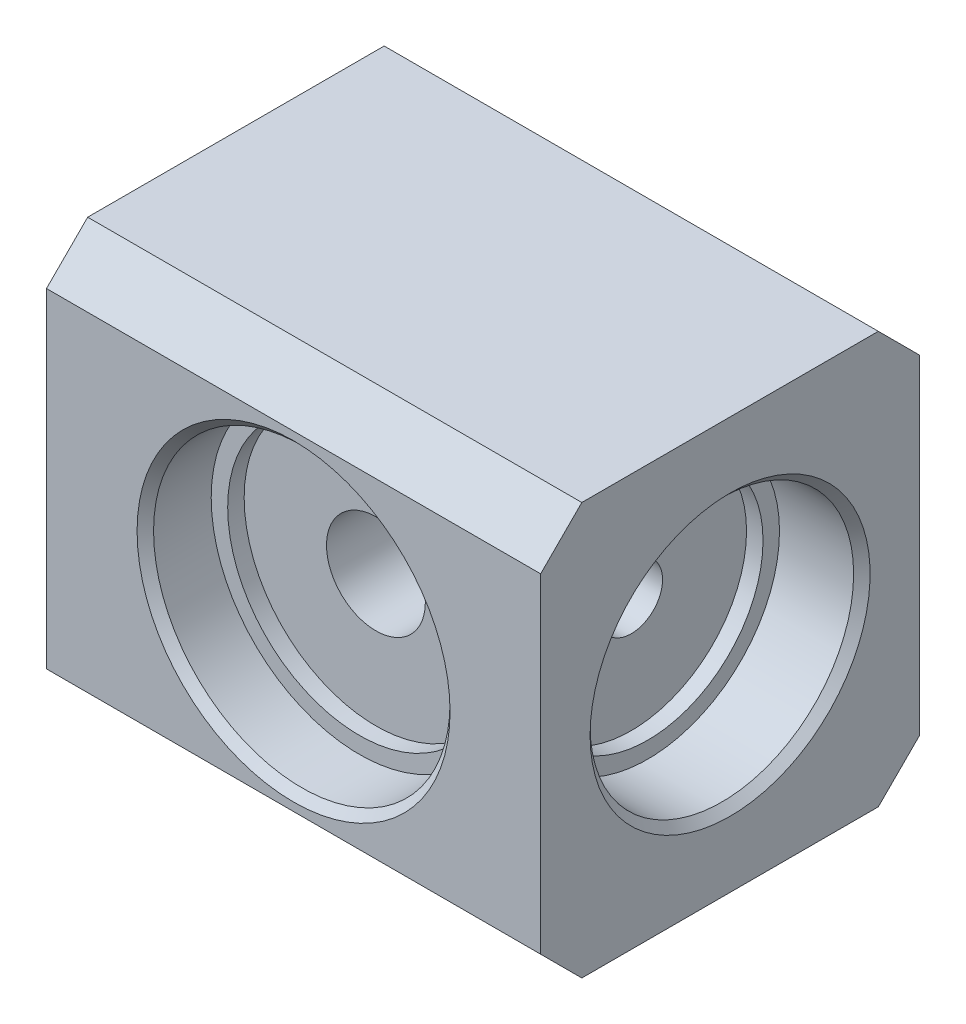
ISO-10303-21;
HEADER;
FILE_DESCRIPTION(('STEP AP214'),'2;1');
FILE_NAME('part.step','',(''),(''),'','','');
FILE_SCHEMA(('AUTOMOTIVE_DESIGN { 1 0 10303 214 1 1 1 1 }'));
ENDSEC;
DATA;
#1=APPLICATION_CONTEXT('core data for automotive mechanical design processes');
#2=APPLICATION_PROTOCOL_DEFINITION('international standard','automotive_design',2000,#1);
#3=PRODUCT_CONTEXT('',#1,'mechanical');
#4=PRODUCT('Part','Part','',(#3));
#5=PRODUCT_RELATED_PRODUCT_CATEGORY('part','',(#4));
#6=PRODUCT_DEFINITION_FORMATION('','',#4);
#7=PRODUCT_DEFINITION_CONTEXT('part definition',#1,'design');
#8=PRODUCT_DEFINITION('design','',#6,#7);
#9=PRODUCT_DEFINITION_SHAPE('','',#8);
#10=(LENGTH_UNIT() NAMED_UNIT(*) SI_UNIT(.MILLI.,.METRE.));
#11=(NAMED_UNIT(*) PLANE_ANGLE_UNIT() SI_UNIT($,.RADIAN.));
#12=(NAMED_UNIT(*) SI_UNIT($,.STERADIAN.) SOLID_ANGLE_UNIT());
#13=UNCERTAINTY_MEASURE_WITH_UNIT(LENGTH_MEASURE(1.E-05),#10,'distance_accuracy_value','');
#14=(GEOMETRIC_REPRESENTATION_CONTEXT(3) GLOBAL_UNCERTAINTY_ASSIGNED_CONTEXT((#13)) GLOBAL_UNIT_ASSIGNED_CONTEXT((#10,
#11,#12)) REPRESENTATION_CONTEXT('',''));
#15=CARTESIAN_POINT('',(0.,0.,0.));
#16=DIRECTION('',(0.,0.,1.));
#17=DIRECTION('',(1.,0.,0.));
#18=AXIS2_PLACEMENT_3D('',#15,#16,#17);
#19=CARTESIAN_POINT('',(15.,12.5,-20.9852813742386));
#20=DIRECTION('',(0.,0.,1.));
#21=DIRECTION('',(1.,0.,0.));
#22=AXIS2_PLACEMENT_3D('',#19,#20,#21);
#23=CYLINDRICAL_SURFACE('',#22,3.);
#24=CARTESIAN_POINT('',(15.,12.5,5.5));
#25=DIRECTION('',(0.,0.,1.));
#26=DIRECTION('',(1.,0.,0.));
#27=AXIS2_PLACEMENT_3D('',#24,#25,#26);
#28=CIRCLE('',#27,3.);
#29=CARTESIAN_POINT('',(18.,12.5,5.5));
#30=VERTEX_POINT('',#29);
#31=EDGE_CURVE('E364',#30,#30,#28,.F.);
#32=ORIENTED_EDGE('',*,*,#31,.F.);
#33=EDGE_LOOP('',(#32));
#34=FACE_BOUND('',#33,.T.);
#35=CARTESIAN_POINT('',(15.,12.5,-7.50000000000001));
#36=DIRECTION('',(0.,0.,-1.));
#37=DIRECTION('',(-1.,0.,0.));
#38=AXIS2_PLACEMENT_3D('',#35,#36,#37);
#39=CIRCLE('',#38,3.);
#40=CARTESIAN_POINT('',(12.,12.5,-7.50000000000001));
#41=VERTEX_POINT('',#40);
#42=EDGE_CURVE('E146',#41,#41,#39,.F.);
#43=ORIENTED_EDGE('',*,*,#42,.F.);
#44=EDGE_LOOP('',(#43));
#45=FACE_BOUND('',#44,.T.);
#46=ADVANCED_FACE('F45',(#34,#45),#23,.F.);
#47=CARTESIAN_POINT('',(0.,25.,-12.5));
#48=DIRECTION('',(1.,0.,0.));
#49=DIRECTION('',(0.,0.,-1.));
#50=AXIS2_PLACEMENT_3D('',#47,#48,#49);
#51=PLANE('',#50);
#52=CARTESIAN_POINT('',(0.,12.5,-1.00000000000001));
#53=DIRECTION('',(1.,0.,0.));
#54=DIRECTION('',(0.,0.,-1.));
#55=AXIS2_PLACEMENT_3D('',#52,#53,#54);
#56=CIRCLE('',#55,8.49999999999999);
#57=CARTESIAN_POINT('',(0.,12.5,-9.49999999999999));
#58=VERTEX_POINT('',#57);
#59=EDGE_CURVE('E172',#58,#58,#56,.T.);
#60=ORIENTED_EDGE('',*,*,#59,.T.);
#61=EDGE_LOOP('',(#60));
#62=FACE_BOUND('',#61,.T.);
#63=DIRECTION('',(0.,-1.,0.));
#64=VECTOR('',#63,1.);
#65=CARTESIAN_POINT('',(0.,25.,-12.5));
#66=LINE('',#65,#64);
#67=CARTESIAN_POINT('',(0.,22.5,-12.5));
#68=VERTEX_POINT('',#67);
#69=CARTESIAN_POINT('',(0.,2.5,-12.5));
#70=VERTEX_POINT('',#69);
#71=EDGE_CURVE('E116',#68,#70,#66,.T.);
#72=ORIENTED_EDGE('',*,*,#71,.T.);
#73=DIRECTION('',(0.,0.707106781186547,-0.707106781186549));
#74=VECTOR('',#73,1.);
#75=CARTESIAN_POINT('',(0.,2.5,-12.5));
#76=LINE('',#75,#74);
#77=CARTESIAN_POINT('',(0.,0.,-10.));
#78=VERTEX_POINT('',#77);
#79=EDGE_CURVE('E152',#70,#78,#76,.F.);
#80=ORIENTED_EDGE('',*,*,#79,.T.);
#81=DIRECTION('',(0.,0.,1.));
#82=VECTOR('',#81,1.);
#83=CARTESIAN_POINT('',(0.,0.,-12.5));
#84=LINE('',#83,#82);
#85=CARTESIAN_POINT('',(0.,0.,8.));
#86=VERTEX_POINT('',#85);
#87=EDGE_CURVE('E347',#78,#86,#84,.T.);
#88=ORIENTED_EDGE('',*,*,#87,.T.);
#89=DIRECTION('',(0.,-0.707106781186547,-0.707106781186549));
#90=VECTOR('',#89,1.);
#91=CARTESIAN_POINT('',(0.,2.5,10.5));
#92=LINE('',#91,#90);
#93=CARTESIAN_POINT('',(0.,2.5,10.5));
#94=VERTEX_POINT('',#93);
#95=EDGE_CURVE('E150',#86,#94,#92,.F.);
#96=ORIENTED_EDGE('',*,*,#95,.T.);
#97=DIRECTION('',(0.,-1.,0.));
#98=VECTOR('',#97,1.);
#99=CARTESIAN_POINT('',(0.,25.,10.5));
#100=LINE('',#99,#98);
#101=CARTESIAN_POINT('',(0.,22.5,10.5));
#102=VERTEX_POINT('',#101);
#103=EDGE_CURVE('E139',#102,#94,#100,.T.);
#104=ORIENTED_EDGE('',*,*,#103,.F.);
#105=DIRECTION('',(0.,0.707106781186549,-0.707106781186547));
#106=VECTOR('',#105,1.);
#107=CARTESIAN_POINT('',(0.,25.,8.));
#108=LINE('',#107,#106);
#109=CARTESIAN_POINT('',(0.,25.,8.));
#110=VERTEX_POINT('',#109);
#111=EDGE_CURVE('E123',#102,#110,#108,.T.);
#112=ORIENTED_EDGE('',*,*,#111,.T.);
#113=DIRECTION('',(0.,0.,1.));
#114=VECTOR('',#113,1.);
#115=CARTESIAN_POINT('',(0.,25.,-12.5));
#116=LINE('',#115,#114);
#117=CARTESIAN_POINT('',(0.,25.,-10.));
#118=VERTEX_POINT('',#117);
#119=EDGE_CURVE('E118',#118,#110,#116,.T.);
#120=ORIENTED_EDGE('',*,*,#119,.F.);
#121=DIRECTION('',(0.,-0.707106781186549,-0.707106781186547));
#122=VECTOR('',#121,1.);
#123=CARTESIAN_POINT('',(0.,25.,-10.));
#124=LINE('',#123,#122);
#125=EDGE_CURVE('E113',#118,#68,#124,.T.);
#126=ORIENTED_EDGE('',*,*,#125,.T.);
#127=EDGE_LOOP('',(#72,#80,#88,#96,#104,#112,#120,#126));
#128=FACE_BOUND('',#127,.T.);
#129=ADVANCED_FACE('F115',(#62,#128),#51,.F.);
#130=CARTESIAN_POINT('',(0.,25.,10.5));
#131=DIRECTION('',(0.,0.,-1.));
#132=DIRECTION('',(-1.,0.,0.));
#133=AXIS2_PLACEMENT_3D('',#130,#131,#132);
#134=PLANE('',#133);
#135=CARTESIAN_POINT('',(15.,12.5,10.5));
#136=DIRECTION('',(0.,0.,-1.));
#137=DIRECTION('',(-1.,0.,0.));
#138=AXIS2_PLACEMENT_3D('',#135,#136,#137);
#139=CIRCLE('',#138,9.50000000000001);
#140=CARTESIAN_POINT('',(5.49999999999999,12.5,10.5));
#141=VERTEX_POINT('',#140);
#142=EDGE_CURVE('E11',#141,#141,#139,.T.);
#143=ORIENTED_EDGE('',*,*,#142,.T.);
#144=EDGE_LOOP('',(#143));
#145=FACE_BOUND('',#144,.T.);
#146=ORIENTED_EDGE('',*,*,#103,.T.);
#147=DIRECTION('',(1.,0.,0.));
#148=VECTOR('',#147,1.);
#149=CARTESIAN_POINT('',(0.,2.5,10.5));
#150=LINE('',#149,#148);
#151=CARTESIAN_POINT('',(30.,2.5,10.5));
#152=VERTEX_POINT('',#151);
#153=EDGE_CURVE('E165',#94,#152,#150,.T.);
#154=ORIENTED_EDGE('',*,*,#153,.T.);
#155=DIRECTION('',(0.,-1.,0.));
#156=VECTOR('',#155,1.);
#157=CARTESIAN_POINT('',(30.,25.,10.5));
#158=LINE('',#157,#156);
#159=CARTESIAN_POINT('',(30.,22.5,10.5));
#160=VERTEX_POINT('',#159);
#161=EDGE_CURVE('E143',#160,#152,#158,.T.);
#162=ORIENTED_EDGE('',*,*,#161,.F.);
#163=DIRECTION('',(-1.,0.,0.));
#164=VECTOR('',#163,1.);
#165=CARTESIAN_POINT('',(0.,22.5,10.5));
#166=LINE('',#165,#164);
#167=EDGE_CURVE('E163',#160,#102,#166,.T.);
#168=ORIENTED_EDGE('',*,*,#167,.T.);
#169=EDGE_LOOP('',(#146,#154,#162,#168));
#170=FACE_BOUND('',#169,.T.);
#171=ADVANCED_FACE('F212',(#145,#170),#134,.F.);
#172=CARTESIAN_POINT('',(30.,25.,-12.5));
#173=DIRECTION('',(-1.,0.,0.));
#174=DIRECTION('',(0.,0.,1.));
#175=AXIS2_PLACEMENT_3D('',#172,#173,#174);
#176=PLANE('',#175);
#177=CARTESIAN_POINT('',(30.,12.5,-1.00000000000001));
#178=DIRECTION('',(-1.,0.,0.));
#179=DIRECTION('',(0.,0.,1.));
#180=AXIS2_PLACEMENT_3D('',#177,#178,#179);
#181=CIRCLE('',#180,8.5);
#182=CARTESIAN_POINT('',(30.,12.5,7.5));
#183=VERTEX_POINT('',#182);
#184=EDGE_CURVE('E181',#183,#183,#181,.T.);
#185=ORIENTED_EDGE('',*,*,#184,.T.);
#186=EDGE_LOOP('',(#185));
#187=FACE_BOUND('',#186,.T.);
#188=DIRECTION('',(0.,0.,-1.));
#189=VECTOR('',#188,1.);
#190=CARTESIAN_POINT('',(30.,0.,-12.5));
#191=LINE('',#190,#189);
#192=CARTESIAN_POINT('',(30.,0.,8.));
#193=VERTEX_POINT('',#192);
#194=CARTESIAN_POINT('',(30.,0.,-10.));
#195=VERTEX_POINT('',#194);
#196=EDGE_CURVE('E351',#193,#195,#191,.T.);
#197=ORIENTED_EDGE('',*,*,#196,.T.);
#198=DIRECTION('',(0.,-0.707106781186547,0.707106781186549));
#199=VECTOR('',#198,1.);
#200=CARTESIAN_POINT('',(30.,2.5,-12.5));
#201=LINE('',#200,#199);
#202=CARTESIAN_POINT('',(30.,2.5,-12.5));
#203=VERTEX_POINT('',#202);
#204=EDGE_CURVE('E161',#195,#203,#201,.F.);
#205=ORIENTED_EDGE('',*,*,#204,.T.);
#206=DIRECTION('',(0.,-1.,0.));
#207=VECTOR('',#206,1.);
#208=CARTESIAN_POINT('',(30.,25.,-12.5));
#209=LINE('',#208,#207);
#210=CARTESIAN_POINT('',(30.,22.5,-12.5));
#211=VERTEX_POINT('',#210);
#212=EDGE_CURVE('E133',#211,#203,#209,.T.);
#213=ORIENTED_EDGE('',*,*,#212,.F.);
#214=DIRECTION('',(0.,0.707106781186549,0.707106781186547));
#215=VECTOR('',#214,1.);
#216=CARTESIAN_POINT('',(30.,25.,-10.));
#217=LINE('',#216,#215);
#218=CARTESIAN_POINT('',(30.,25.,-10.));
#219=VERTEX_POINT('',#218);
#220=EDGE_CURVE('E138',#211,#219,#217,.T.);
#221=ORIENTED_EDGE('',*,*,#220,.T.);
#222=DIRECTION('',(0.,0.,-1.));
#223=VECTOR('',#222,1.);
#224=CARTESIAN_POINT('',(30.,25.,-12.5));
#225=LINE('',#224,#223);
#226=CARTESIAN_POINT('',(30.,25.,8.));
#227=VERTEX_POINT('',#226);
#228=EDGE_CURVE('E134',#227,#219,#225,.T.);
#229=ORIENTED_EDGE('',*,*,#228,.F.);
#230=DIRECTION('',(0.,-0.707106781186549,0.707106781186547));
#231=VECTOR('',#230,1.);
#232=CARTESIAN_POINT('',(30.,25.,8.));
#233=LINE('',#232,#231);
#234=EDGE_CURVE('E69',#227,#160,#233,.T.);
#235=ORIENTED_EDGE('',*,*,#234,.T.);
#236=ORIENTED_EDGE('',*,*,#161,.T.);
#237=DIRECTION('',(0.,0.707106781186547,0.707106781186549));
#238=VECTOR('',#237,1.);
#239=CARTESIAN_POINT('',(30.,2.49999999999999,10.5));
#240=LINE('',#239,#238);
#241=EDGE_CURVE('E61',#152,#193,#240,.F.);
#242=ORIENTED_EDGE('',*,*,#241,.T.);
#243=EDGE_LOOP('',(#197,#205,#213,#221,#229,#235,#236,#242));
#244=FACE_BOUND('',#243,.T.);
#245=ADVANCED_FACE('F286',(#187,#244),#176,.F.);
#246=CARTESIAN_POINT('',(0.,25.,-12.5));
#247=DIRECTION('',(0.,0.,1.));
#248=DIRECTION('',(1.,0.,0.));
#249=AXIS2_PLACEMENT_3D('',#246,#247,#248);
#250=PLANE('',#249);
#251=CARTESIAN_POINT('',(15.,12.5,-12.5));
#252=DIRECTION('',(0.,0.,1.));
#253=DIRECTION('',(1.,0.,0.));
#254=AXIS2_PLACEMENT_3D('',#251,#252,#253);
#255=CIRCLE('',#254,9.5);
#256=CARTESIAN_POINT('',(24.5,12.5,-12.5));
#257=VERTEX_POINT('',#256);
#258=EDGE_CURVE('E184',#257,#257,#255,.T.);
#259=ORIENTED_EDGE('',*,*,#258,.T.);
#260=EDGE_LOOP('',(#259));
#261=FACE_BOUND('',#260,.T.);
#262=ORIENTED_EDGE('',*,*,#212,.T.);
#263=DIRECTION('',(-1.,0.,0.));
#264=VECTOR('',#263,1.);
#265=CARTESIAN_POINT('',(0.,2.5,-12.5));
#266=LINE('',#265,#264);
#267=EDGE_CURVE('E124',#203,#70,#266,.T.);
#268=ORIENTED_EDGE('',*,*,#267,.T.);
#269=ORIENTED_EDGE('',*,*,#71,.F.);
#270=DIRECTION('',(1.,0.,0.));
#271=VECTOR('',#270,1.);
#272=CARTESIAN_POINT('',(30.,22.5,-12.5));
#273=LINE('',#272,#271);
#274=EDGE_CURVE('E130',#68,#211,#273,.T.);
#275=ORIENTED_EDGE('',*,*,#274,.T.);
#276=EDGE_LOOP('',(#262,#268,#269,#275));
#277=FACE_BOUND('',#276,.T.);
#278=ADVANCED_FACE('F129',(#261,#277),#250,.F.);
#279=CARTESIAN_POINT('',(0.,25.,0.));
#280=DIRECTION('',(0.,1.,0.));
#281=DIRECTION('',(0.,0.,1.));
#282=AXIS2_PLACEMENT_3D('',#279,#280,#281);
#283=PLANE('',#282);
#284=ORIENTED_EDGE('',*,*,#119,.T.);
#285=DIRECTION('',(1.,0.,0.));
#286=VECTOR('',#285,1.);
#287=CARTESIAN_POINT('',(30.,25.,8.));
#288=LINE('',#287,#286);
#289=EDGE_CURVE('E169',#110,#227,#288,.T.);
#290=ORIENTED_EDGE('',*,*,#289,.T.);
#291=ORIENTED_EDGE('',*,*,#228,.T.);
#292=DIRECTION('',(-1.,0.,0.));
#293=VECTOR('',#292,1.);
#294=CARTESIAN_POINT('',(0.,25.,-10.));
#295=LINE('',#294,#293);
#296=EDGE_CURVE('E167',#219,#118,#295,.T.);
#297=ORIENTED_EDGE('',*,*,#296,.T.);
#298=EDGE_LOOP('',(#284,#290,#291,#297));
#299=FACE_BOUND('',#298,.T.);
#300=ADVANCED_FACE('F277',(#299),#283,.T.);
#301=CARTESIAN_POINT('',(0.,0.,0.));
#302=DIRECTION('',(0.,1.,0.));
#303=DIRECTION('',(0.,0.,1.));
#304=AXIS2_PLACEMENT_3D('',#301,#302,#303);
#305=PLANE('',#304);
#306=ORIENTED_EDGE('',*,*,#87,.F.);
#307=DIRECTION('',(1.,0.,0.));
#308=VECTOR('',#307,1.);
#309=CARTESIAN_POINT('',(0.,0.,-10.));
#310=LINE('',#309,#308);
#311=EDGE_CURVE('E156',#78,#195,#310,.T.);
#312=ORIENTED_EDGE('',*,*,#311,.T.);
#313=ORIENTED_EDGE('',*,*,#196,.F.);
#314=DIRECTION('',(-1.,0.,0.));
#315=VECTOR('',#314,1.);
#316=CARTESIAN_POINT('',(0.,0.,8.));
#317=LINE('',#316,#315);
#318=EDGE_CURVE('E154',#193,#86,#317,.T.);
#319=ORIENTED_EDGE('',*,*,#318,.T.);
#320=EDGE_LOOP('',(#306,#312,#313,#319));
#321=FACE_BOUND('',#320,.T.);
#322=ADVANCED_FACE('F275',(#321),#305,.F.);
#323=CARTESIAN_POINT('',(25.,12.5,-1.00000000000001));
#324=DIRECTION('',(1.,0.,0.));
#325=DIRECTION('',(0.,0.,-1.));
#326=AXIS2_PLACEMENT_3D('',#323,#324,#325);
#327=CYLINDRICAL_SURFACE('',#326,8.);
#328=CARTESIAN_POINT('',(29.5,12.5,-1.00000000000001));
#329=DIRECTION('',(-1.,0.,0.));
#330=DIRECTION('',(0.,0.,1.));
#331=AXIS2_PLACEMENT_3D('',#328,#329,#330);
#332=CIRCLE('',#331,8.);
#333=CARTESIAN_POINT('',(29.5,12.5,6.99999999999999));
#334=VERTEX_POINT('',#333);
#335=EDGE_CURVE('E178',#334,#334,#332,.F.);
#336=ORIENTED_EDGE('',*,*,#335,.T.);
#337=EDGE_LOOP('',(#336));
#338=FACE_BOUND('',#337,.T.);
#339=CARTESIAN_POINT('',(25.,12.5,-1.00000000000001));
#340=DIRECTION('',(1.,0.,0.));
#341=DIRECTION('',(0.,0.,-1.));
#342=AXIS2_PLACEMENT_3D('',#339,#340,#341);
#343=CIRCLE('',#342,8.);
#344=CARTESIAN_POINT('',(25.,12.5,-9.00000000000001));
#345=VERTEX_POINT('',#344);
#346=EDGE_CURVE('E345',#345,#345,#343,.T.);
#347=ORIENTED_EDGE('',*,*,#346,.F.);
#348=EDGE_LOOP('',(#347));
#349=FACE_BOUND('',#348,.T.);
#350=ADVANCED_FACE('F271',(#338,#349),#327,.F.);
#351=CARTESIAN_POINT('',(25.,12.5,-1.00000000000001));
#352=DIRECTION('',(1.,0.,0.));
#353=DIRECTION('',(0.,0.,-1.));
#354=AXIS2_PLACEMENT_3D('',#351,#352,#353);
#355=PLANE('',#354);
#356=CARTESIAN_POINT('',(25.,12.5,-1.));
#357=DIRECTION('',(1.,0.,0.));
#358=DIRECTION('',(0.,0.,-1.));
#359=AXIS2_PLACEMENT_3D('',#356,#357,#358);
#360=CIRCLE('',#359,7.);
#361=CARTESIAN_POINT('',(25.,12.5,-8.));
#362=VERTEX_POINT('',#361);
#363=EDGE_CURVE('E354',#362,#362,#360,.T.);
#364=ORIENTED_EDGE('',*,*,#363,.F.);
#365=EDGE_LOOP('',(#364));
#366=FACE_BOUND('',#365,.T.);
#367=ORIENTED_EDGE('',*,*,#346,.T.);
#368=EDGE_LOOP('',(#367));
#369=FACE_BOUND('',#368,.T.);
#370=ADVANCED_FACE('F267',(#366,#369),#355,.T.);
#371=CARTESIAN_POINT('',(24.,12.5,-1.));
#372=DIRECTION('',(1.,0.,0.));
#373=DIRECTION('',(0.,0.,-1.));
#374=AXIS2_PLACEMENT_3D('',#371,#372,#373);
#375=CYLINDRICAL_SURFACE('',#374,7.);
#376=CARTESIAN_POINT('',(24.,12.5,-1.));
#377=DIRECTION('',(1.,0.,0.));
#378=DIRECTION('',(0.,0.,-1.));
#379=AXIS2_PLACEMENT_3D('',#376,#377,#378);
#380=CIRCLE('',#379,7.);
#381=CARTESIAN_POINT('',(24.,12.5,-8.));
#382=VERTEX_POINT('',#381);
#383=EDGE_CURVE('E348',#382,#382,#380,.T.);
#384=ORIENTED_EDGE('',*,*,#383,.F.);
#385=EDGE_LOOP('',(#384));
#386=FACE_BOUND('',#385,.T.);
#387=ORIENTED_EDGE('',*,*,#363,.T.);
#388=EDGE_LOOP('',(#387));
#389=FACE_BOUND('',#388,.T.);
#390=ADVANCED_FACE('F263',(#386,#389),#375,.F.);
#391=CARTESIAN_POINT('',(24.,12.5,-1.));
#392=DIRECTION('',(1.,0.,0.));
#393=DIRECTION('',(0.,0.,-1.));
#394=AXIS2_PLACEMENT_3D('',#391,#392,#393);
#395=PLANE('',#394);
#396=CARTESIAN_POINT('',(24.,12.5,-1.));
#397=DIRECTION('',(1.,0.,0.));
#398=DIRECTION('',(0.,0.,-1.));
#399=AXIS2_PLACEMENT_3D('',#396,#397,#398);
#400=CIRCLE('',#399,1.9);
#401=CARTESIAN_POINT('',(24.,12.5,-2.9));
#402=VERTEX_POINT('',#401);
#403=EDGE_CURVE('E397',#402,#402,#400,.T.);
#404=ORIENTED_EDGE('',*,*,#403,.F.);
#405=EDGE_LOOP('',(#404));
#406=FACE_BOUND('',#405,.T.);
#407=ORIENTED_EDGE('',*,*,#383,.T.);
#408=EDGE_LOOP('',(#407));
#409=FACE_BOUND('',#408,.T.);
#410=ADVANCED_FACE('F259',(#406,#409),#395,.T.);
#411=CARTESIAN_POINT('',(20.,12.5,-0.999999999999999));
#412=DIRECTION('',(1.,0.,0.));
#413=DIRECTION('',(0.,0.,-1.));
#414=AXIS2_PLACEMENT_3D('',#411,#412,#413);
#415=CYLINDRICAL_SURFACE('',#414,1.9);
#416=CARTESIAN_POINT('',(20.,12.5,-0.999999999999999));
#417=DIRECTION('',(1.,0.,0.));
#418=DIRECTION('',(0.,0.,-1.));
#419=AXIS2_PLACEMENT_3D('',#416,#417,#418);
#420=CIRCLE('',#419,1.9);
#421=CARTESIAN_POINT('',(20.,12.5,-2.9));
#422=VERTEX_POINT('',#421);
#423=EDGE_CURVE('E398',#422,#422,#420,.T.);
#424=ORIENTED_EDGE('',*,*,#423,.F.);
#425=EDGE_LOOP('',(#424));
#426=FACE_BOUND('',#425,.T.);
#427=ORIENTED_EDGE('',*,*,#403,.T.);
#428=EDGE_LOOP('',(#427));
#429=FACE_BOUND('',#428,.T.);
#430=ADVANCED_FACE('F255',(#426,#429),#415,.F.);
#431=CARTESIAN_POINT('',(20.,12.5,-0.999999999999999));
#432=DIRECTION('',(1.,0.,0.));
#433=DIRECTION('',(0.,0.,-1.));
#434=AXIS2_PLACEMENT_3D('',#431,#432,#433);
#435=PLANE('',#434);
#436=ORIENTED_EDGE('',*,*,#423,.T.);
#437=EDGE_LOOP('',(#436));
#438=FACE_BOUND('',#437,.T.);
#439=ADVANCED_FACE('F251',(#438),#435,.T.);
#440=CARTESIAN_POINT('',(5.,12.5,-1.00000000000001));
#441=DIRECTION('',(-1.,0.,0.));
#442=DIRECTION('',(0.,0.,1.));
#443=AXIS2_PLACEMENT_3D('',#440,#441,#442);
#444=CYLINDRICAL_SURFACE('',#443,8.);
#445=CARTESIAN_POINT('',(0.499999999999991,12.5,-1.00000000000001));
#446=DIRECTION('',(1.,0.,0.));
#447=DIRECTION('',(0.,0.,-1.));
#448=AXIS2_PLACEMENT_3D('',#445,#446,#447);
#449=CIRCLE('',#448,8.);
#450=CARTESIAN_POINT('',(0.499999999999991,12.5,-9.00000000000001));
#451=VERTEX_POINT('',#450);
#452=EDGE_CURVE('E175',#451,#451,#449,.F.);
#453=ORIENTED_EDGE('',*,*,#452,.T.);
#454=EDGE_LOOP('',(#453));
#455=FACE_BOUND('',#454,.T.);
#456=CARTESIAN_POINT('',(5.,12.5,-1.00000000000001));
#457=DIRECTION('',(1.,0.,0.));
#458=DIRECTION('',(0.,0.,-1.));
#459=AXIS2_PLACEMENT_3D('',#456,#457,#458);
#460=CIRCLE('',#459,8.);
#461=CARTESIAN_POINT('',(5.,12.5,-9.00000000000001));
#462=VERTEX_POINT('',#461);
#463=EDGE_CURVE('E392',#462,#462,#460,.T.);
#464=ORIENTED_EDGE('',*,*,#463,.T.);
#465=EDGE_LOOP('',(#464));
#466=FACE_BOUND('',#465,.T.);
#467=ADVANCED_FACE('F247',(#455,#466),#444,.F.);
#468=CARTESIAN_POINT('',(5.,12.5,-1.00000000000001));
#469=DIRECTION('',(-1.,0.,0.));
#470=DIRECTION('',(0.,0.,-1.));
#471=AXIS2_PLACEMENT_3D('',#468,#469,#470);
#472=PLANE('',#471);
#473=CARTESIAN_POINT('',(5.,12.5,-1.));
#474=DIRECTION('',(1.,0.,0.));
#475=DIRECTION('',(0.,0.,-1.));
#476=AXIS2_PLACEMENT_3D('',#473,#474,#475);
#477=CIRCLE('',#476,7.);
#478=CARTESIAN_POINT('',(5.,12.5,-8.));
#479=VERTEX_POINT('',#478);
#480=EDGE_CURVE('E386',#479,#479,#477,.T.);
#481=ORIENTED_EDGE('',*,*,#480,.T.);
#482=EDGE_LOOP('',(#481));
#483=FACE_BOUND('',#482,.T.);
#484=ORIENTED_EDGE('',*,*,#463,.F.);
#485=EDGE_LOOP('',(#484));
#486=FACE_BOUND('',#485,.T.);
#487=ADVANCED_FACE('F243',(#483,#486),#472,.T.);
#488=CARTESIAN_POINT('',(6.,12.5,-1.));
#489=DIRECTION('',(-1.,0.,0.));
#490=DIRECTION('',(0.,0.,1.));
#491=AXIS2_PLACEMENT_3D('',#488,#489,#490);
#492=CYLINDRICAL_SURFACE('',#491,7.);
#493=CARTESIAN_POINT('',(6.,12.5,-1.));
#494=DIRECTION('',(1.,0.,0.));
#495=DIRECTION('',(0.,0.,-1.));
#496=AXIS2_PLACEMENT_3D('',#493,#494,#495);
#497=CIRCLE('',#496,7.);
#498=CARTESIAN_POINT('',(6.,12.5,-8.));
#499=VERTEX_POINT('',#498);
#500=EDGE_CURVE('E389',#499,#499,#497,.T.);
#501=ORIENTED_EDGE('',*,*,#500,.T.);
#502=EDGE_LOOP('',(#501));
#503=FACE_BOUND('',#502,.T.);
#504=ORIENTED_EDGE('',*,*,#480,.F.);
#505=EDGE_LOOP('',(#504));
#506=FACE_BOUND('',#505,.T.);
#507=ADVANCED_FACE('F239',(#503,#506),#492,.F.);
#508=CARTESIAN_POINT('',(6.,12.5,-1.));
#509=DIRECTION('',(-1.,0.,0.));
#510=DIRECTION('',(0.,0.,-1.));
#511=AXIS2_PLACEMENT_3D('',#508,#509,#510);
#512=PLANE('',#511);
#513=CARTESIAN_POINT('',(6.,12.5,-1.));
#514=DIRECTION('',(1.,0.,0.));
#515=DIRECTION('',(0.,0.,-1.));
#516=AXIS2_PLACEMENT_3D('',#513,#514,#515);
#517=CIRCLE('',#516,1.9);
#518=CARTESIAN_POINT('',(6.,12.5,-2.9));
#519=VERTEX_POINT('',#518);
#520=EDGE_CURVE('E370',#519,#519,#517,.T.);
#521=ORIENTED_EDGE('',*,*,#520,.T.);
#522=EDGE_LOOP('',(#521));
#523=FACE_BOUND('',#522,.T.);
#524=ORIENTED_EDGE('',*,*,#500,.F.);
#525=EDGE_LOOP('',(#524));
#526=FACE_BOUND('',#525,.T.);
#527=ADVANCED_FACE('F235',(#523,#526),#512,.T.);
#528=CARTESIAN_POINT('',(10.,12.5,-0.999999999999999));
#529=DIRECTION('',(-1.,0.,0.));
#530=DIRECTION('',(0.,0.,1.));
#531=AXIS2_PLACEMENT_3D('',#528,#529,#530);
#532=CYLINDRICAL_SURFACE('',#531,1.9);
#533=CARTESIAN_POINT('',(10.,12.5,-0.999999999999999));
#534=DIRECTION('',(1.,0.,0.));
#535=DIRECTION('',(0.,0.,-1.));
#536=AXIS2_PLACEMENT_3D('',#533,#534,#535);
#537=CIRCLE('',#536,1.9);
#538=CARTESIAN_POINT('',(10.,12.5,-2.9));
#539=VERTEX_POINT('',#538);
#540=EDGE_CURVE('E383',#539,#539,#537,.T.);
#541=ORIENTED_EDGE('',*,*,#540,.T.);
#542=EDGE_LOOP('',(#541));
#543=FACE_BOUND('',#542,.T.);
#544=ORIENTED_EDGE('',*,*,#520,.F.);
#545=EDGE_LOOP('',(#544));
#546=FACE_BOUND('',#545,.T.);
#547=ADVANCED_FACE('F231',(#543,#546),#532,.F.);
#548=CARTESIAN_POINT('',(10.,12.5,-0.999999999999999));
#549=DIRECTION('',(-1.,0.,0.));
#550=DIRECTION('',(0.,0.,-1.));
#551=AXIS2_PLACEMENT_3D('',#548,#549,#550);
#552=PLANE('',#551);
#553=ORIENTED_EDGE('',*,*,#540,.F.);
#554=EDGE_LOOP('',(#553));
#555=FACE_BOUND('',#554,.T.);
#556=ADVANCED_FACE('F228',(#555),#552,.T.);
#557=CARTESIAN_POINT('',(15.,12.5,6.5));
#558=DIRECTION('',(0.,0.,1.));
#559=DIRECTION('',(1.,0.,0.));
#560=AXIS2_PLACEMENT_3D('',#557,#558,#559);
#561=CYLINDRICAL_SURFACE('',#560,9.00000000000001);
#562=CARTESIAN_POINT('',(15.,12.5,10.));
#563=DIRECTION('',(0.,0.,-1.));
#564=DIRECTION('',(-1.,0.,0.));
#565=AXIS2_PLACEMENT_3D('',#562,#563,#564);
#566=CIRCLE('',#565,9.00000000000001);
#567=CARTESIAN_POINT('',(6.,12.5,10.));
#568=VERTEX_POINT('',#567);
#569=EDGE_CURVE('E54',#568,#568,#566,.F.);
#570=ORIENTED_EDGE('',*,*,#569,.T.);
#571=EDGE_LOOP('',(#570));
#572=FACE_BOUND('',#571,.T.);
#573=CARTESIAN_POINT('',(15.,12.5,6.5));
#574=DIRECTION('',(0.,0.,1.));
#575=DIRECTION('',(1.,0.,0.));
#576=AXIS2_PLACEMENT_3D('',#573,#574,#575);
#577=CIRCLE('',#576,9.00000000000001);
#578=CARTESIAN_POINT('',(24.,12.5,6.5));
#579=VERTEX_POINT('',#578);
#580=EDGE_CURVE('E366',#579,#579,#577,.T.);
#581=ORIENTED_EDGE('',*,*,#580,.F.);
#582=EDGE_LOOP('',(#581));
#583=FACE_BOUND('',#582,.T.);
#584=ADVANCED_FACE('F192',(#572,#583),#561,.F.);
#585=CARTESIAN_POINT('',(15.,12.5,6.5));
#586=DIRECTION('',(0.,0.,1.));
#587=DIRECTION('',(1.,0.,0.));
#588=AXIS2_PLACEMENT_3D('',#585,#586,#587);
#589=PLANE('',#588);
#590=CARTESIAN_POINT('',(15.,12.5,6.5));
#591=DIRECTION('',(0.,0.,1.));
#592=DIRECTION('',(1.,0.,0.));
#593=AXIS2_PLACEMENT_3D('',#590,#591,#592);
#594=CIRCLE('',#593,8.);
#595=CARTESIAN_POINT('',(23.,12.5,6.5));
#596=VERTEX_POINT('',#595);
#597=EDGE_CURVE('E373',#596,#596,#594,.T.);
#598=ORIENTED_EDGE('',*,*,#597,.F.);
#599=EDGE_LOOP('',(#598));
#600=FACE_BOUND('',#599,.T.);
#601=ORIENTED_EDGE('',*,*,#580,.T.);
#602=EDGE_LOOP('',(#601));
#603=FACE_BOUND('',#602,.T.);
#604=ADVANCED_FACE('F221',(#600,#603),#589,.T.);
#605=CARTESIAN_POINT('',(15.,12.5,5.5));
#606=DIRECTION('',(0.,0.,1.));
#607=DIRECTION('',(1.,0.,0.));
#608=AXIS2_PLACEMENT_3D('',#605,#606,#607);
#609=PLANE('',#608);
#610=CARTESIAN_POINT('',(15.,12.5,5.5));
#611=DIRECTION('',(0.,0.,1.));
#612=DIRECTION('',(1.,0.,0.));
#613=AXIS2_PLACEMENT_3D('',#610,#611,#612);
#614=CIRCLE('',#613,8.);
#615=CARTESIAN_POINT('',(23.,12.5,5.5));
#616=VERTEX_POINT('',#615);
#617=EDGE_CURVE('E367',#616,#616,#614,.T.);
#618=ORIENTED_EDGE('',*,*,#617,.T.);
#619=EDGE_LOOP('',(#618));
#620=FACE_BOUND('',#619,.T.);
#621=ORIENTED_EDGE('',*,*,#31,.T.);
#622=EDGE_LOOP('',(#621));
#623=FACE_BOUND('',#622,.T.);
#624=ADVANCED_FACE('F224',(#620,#623),#609,.T.);
#625=CARTESIAN_POINT('',(15.,12.5,5.5));
#626=DIRECTION('',(0.,0.,1.));
#627=DIRECTION('',(1.,0.,0.));
#628=AXIS2_PLACEMENT_3D('',#625,#626,#627);
#629=CYLINDRICAL_SURFACE('',#628,8.);
#630=ORIENTED_EDGE('',*,*,#617,.F.);
#631=EDGE_LOOP('',(#630));
#632=FACE_BOUND('',#631,.T.);
#633=ORIENTED_EDGE('',*,*,#597,.T.);
#634=EDGE_LOOP('',(#633));
#635=FACE_BOUND('',#634,.T.);
#636=ADVANCED_FACE('F219',(#632,#635),#629,.F.);
#637=CARTESIAN_POINT('',(15.,12.5,-8.50000000000001));
#638=DIRECTION('',(0.,0.,-1.));
#639=DIRECTION('',(1.,0.,0.));
#640=AXIS2_PLACEMENT_3D('',#637,#638,#639);
#641=PLANE('',#640);
#642=CARTESIAN_POINT('',(15.,12.5,-8.50000000000001));
#643=DIRECTION('',(0.,0.,1.));
#644=DIRECTION('',(1.,0.,0.));
#645=AXIS2_PLACEMENT_3D('',#642,#643,#644);
#646=CIRCLE('',#645,8.);
#647=CARTESIAN_POINT('',(23.,12.5,-8.50000000000001));
#648=VERTEX_POINT('',#647);
#649=EDGE_CURVE('E421',#648,#648,#646,.T.);
#650=ORIENTED_EDGE('',*,*,#649,.T.);
#651=EDGE_LOOP('',(#650));
#652=FACE_BOUND('',#651,.T.);
#653=CARTESIAN_POINT('',(15.,12.5,-8.50000000000001));
#654=DIRECTION('',(0.,0.,1.));
#655=DIRECTION('',(1.,0.,0.));
#656=AXIS2_PLACEMENT_3D('',#653,#654,#655);
#657=CIRCLE('',#656,9.00000000000001);
#658=CARTESIAN_POINT('',(24.,12.5,-8.50000000000001));
#659=VERTEX_POINT('',#658);
#660=EDGE_CURVE('E378',#659,#659,#657,.T.);
#661=ORIENTED_EDGE('',*,*,#660,.F.);
#662=EDGE_LOOP('',(#661));
#663=FACE_BOUND('',#662,.T.);
#664=ADVANCED_FACE('F441',(#652,#663),#641,.T.);
#665=CARTESIAN_POINT('',(15.,12.5,-8.50000000000001));
#666=DIRECTION('',(0.,0.,-1.));
#667=DIRECTION('',(-1.,0.,0.));
#668=AXIS2_PLACEMENT_3D('',#665,#666,#667);
#669=CYLINDRICAL_SURFACE('',#668,9.00000000000001);
#670=CARTESIAN_POINT('',(15.,12.5,-12.));
#671=DIRECTION('',(0.,0.,1.));
#672=DIRECTION('',(1.,0.,0.));
#673=AXIS2_PLACEMENT_3D('',#670,#671,#672);
#674=CIRCLE('',#673,9.00000000000001);
#675=CARTESIAN_POINT('',(24.,12.5,-12.));
#676=VERTEX_POINT('',#675);
#677=EDGE_CURVE('E187',#676,#676,#674,.F.);
#678=ORIENTED_EDGE('',*,*,#677,.T.);
#679=EDGE_LOOP('',(#678));
#680=FACE_BOUND('',#679,.T.);
#681=ORIENTED_EDGE('',*,*,#660,.T.);
#682=EDGE_LOOP('',(#681));
#683=FACE_BOUND('',#682,.T.);
#684=ADVANCED_FACE('F433',(#680,#683),#669,.F.);
#685=CARTESIAN_POINT('',(15.,12.5,-7.50000000000001));
#686=DIRECTION('',(0.,0.,-1.));
#687=DIRECTION('',(1.,0.,0.));
#688=AXIS2_PLACEMENT_3D('',#685,#686,#687);
#689=PLANE('',#688);
#690=CARTESIAN_POINT('',(15.,12.5,-7.50000000000001));
#691=DIRECTION('',(0.,0.,1.));
#692=DIRECTION('',(1.,0.,0.));
#693=AXIS2_PLACEMENT_3D('',#690,#691,#692);
#694=CIRCLE('',#693,8.);
#695=CARTESIAN_POINT('',(23.,12.5,-7.50000000000001));
#696=VERTEX_POINT('',#695);
#697=EDGE_CURVE('E424',#696,#696,#694,.T.);
#698=ORIENTED_EDGE('',*,*,#697,.F.);
#699=EDGE_LOOP('',(#698));
#700=FACE_BOUND('',#699,.T.);
#701=ORIENTED_EDGE('',*,*,#42,.T.);
#702=EDGE_LOOP('',(#701));
#703=FACE_BOUND('',#702,.T.);
#704=ADVANCED_FACE('F431',(#700,#703),#689,.T.);
#705=CARTESIAN_POINT('',(15.,12.5,-7.50000000000001));
#706=DIRECTION('',(0.,0.,-1.));
#707=DIRECTION('',(-1.,0.,0.));
#708=AXIS2_PLACEMENT_3D('',#705,#706,#707);
#709=CYLINDRICAL_SURFACE('',#708,8.);
#710=ORIENTED_EDGE('',*,*,#697,.T.);
#711=EDGE_LOOP('',(#710));
#712=FACE_BOUND('',#711,.T.);
#713=ORIENTED_EDGE('',*,*,#649,.F.);
#714=EDGE_LOOP('',(#713));
#715=FACE_BOUND('',#714,.T.);
#716=ADVANCED_FACE('F302',(#712,#715),#709,.F.);
#717=CARTESIAN_POINT('',(0.,2.5,-12.5));
#718=DIRECTION('',(0.,0.707106781186548,0.707106781186546));
#719=DIRECTION('',(-1.,0.,0.));
#720=AXIS2_PLACEMENT_3D('',#717,#718,#719);
#721=PLANE('',#720);
#722=ORIENTED_EDGE('',*,*,#204,.F.);
#723=ORIENTED_EDGE('',*,*,#311,.F.);
#724=ORIENTED_EDGE('',*,*,#79,.F.);
#725=ORIENTED_EDGE('',*,*,#267,.F.);
#726=EDGE_LOOP('',(#722,#723,#724,#725));
#727=FACE_BOUND('',#726,.T.);
#728=ADVANCED_FACE('F295',(#727),#721,.F.);
#729=CARTESIAN_POINT('',(0.,2.5,10.5));
#730=DIRECTION('',(0.,0.707106781186548,-0.707106781186546));
#731=DIRECTION('',(1.,0.,0.));
#732=AXIS2_PLACEMENT_3D('',#729,#730,#731);
#733=PLANE('',#732);
#734=ORIENTED_EDGE('',*,*,#95,.F.);
#735=ORIENTED_EDGE('',*,*,#318,.F.);
#736=ORIENTED_EDGE('',*,*,#241,.F.);
#737=ORIENTED_EDGE('',*,*,#153,.F.);
#738=EDGE_LOOP('',(#734,#735,#736,#737));
#739=FACE_BOUND('',#738,.T.);
#740=ADVANCED_FACE('F301',(#739),#733,.F.);
#741=CARTESIAN_POINT('',(0.,25.,8.));
#742=DIRECTION('',(0.,0.707106781186546,0.707106781186548));
#743=DIRECTION('',(-1.,0.,0.));
#744=AXIS2_PLACEMENT_3D('',#741,#742,#743);
#745=PLANE('',#744);
#746=ORIENTED_EDGE('',*,*,#111,.F.);
#747=ORIENTED_EDGE('',*,*,#167,.F.);
#748=ORIENTED_EDGE('',*,*,#234,.F.);
#749=ORIENTED_EDGE('',*,*,#289,.F.);
#750=EDGE_LOOP('',(#746,#747,#748,#749));
#751=FACE_BOUND('',#750,.T.);
#752=ADVANCED_FACE('F309',(#751),#745,.T.);
#753=CARTESIAN_POINT('',(0.,25.,-10.));
#754=DIRECTION('',(0.,0.707106781186546,-0.707106781186548));
#755=DIRECTION('',(1.,0.,0.));
#756=AXIS2_PLACEMENT_3D('',#753,#754,#755);
#757=PLANE('',#756);
#758=ORIENTED_EDGE('',*,*,#220,.F.);
#759=ORIENTED_EDGE('',*,*,#274,.F.);
#760=ORIENTED_EDGE('',*,*,#125,.F.);
#761=ORIENTED_EDGE('',*,*,#296,.F.);
#762=EDGE_LOOP('',(#758,#759,#760,#761));
#763=FACE_BOUND('',#762,.T.);
#764=ADVANCED_FACE('F137',(#763),#757,.T.);
#765=CARTESIAN_POINT('',(0.,12.5,-1.00000000000001));
#766=DIRECTION('',(-1.,0.,0.));
#767=DIRECTION('',(0.,0.,1.));
#768=AXIS2_PLACEMENT_3D('',#765,#766,#767);
#769=CONICAL_SURFACE('',#768,8.49999999999999,0.785398163397441);
#770=ORIENTED_EDGE('',*,*,#452,.F.);
#771=EDGE_LOOP('',(#770));
#772=FACE_BOUND('',#771,.T.);
#773=ORIENTED_EDGE('',*,*,#59,.F.);
#774=EDGE_LOOP('',(#773));
#775=FACE_BOUND('',#774,.T.);
#776=ADVANCED_FACE('F321',(#772,#775),#769,.F.);
#777=CARTESIAN_POINT('',(29.5,12.5,-1.00000000000001));
#778=DIRECTION('',(1.,0.,0.));
#779=DIRECTION('',(0.,0.,-1.));
#780=AXIS2_PLACEMENT_3D('',#777,#778,#779);
#781=CONICAL_SURFACE('',#780,8.,0.78539816339745);
#782=ORIENTED_EDGE('',*,*,#184,.F.);
#783=EDGE_LOOP('',(#782));
#784=FACE_BOUND('',#783,.T.);
#785=ORIENTED_EDGE('',*,*,#335,.F.);
#786=EDGE_LOOP('',(#785));
#787=FACE_BOUND('',#786,.T.);
#788=ADVANCED_FACE('F201',(#784,#787),#781,.F.);
#789=CARTESIAN_POINT('',(15.,12.5,-12.5));
#790=DIRECTION('',(0.,0.,-1.));
#791=DIRECTION('',(-1.,0.,0.));
#792=AXIS2_PLACEMENT_3D('',#789,#790,#791);
#793=CONICAL_SURFACE('',#792,9.5,0.785398163397448);
#794=ORIENTED_EDGE('',*,*,#677,.F.);
#795=EDGE_LOOP('',(#794));
#796=FACE_BOUND('',#795,.T.);
#797=ORIENTED_EDGE('',*,*,#258,.F.);
#798=EDGE_LOOP('',(#797));
#799=FACE_BOUND('',#798,.T.);
#800=ADVANCED_FACE('F196',(#796,#799),#793,.F.);
#801=CARTESIAN_POINT('',(15.,12.5,10.));
#802=DIRECTION('',(0.,0.,1.));
#803=DIRECTION('',(1.,0.,0.));
#804=AXIS2_PLACEMENT_3D('',#801,#802,#803);
#805=CONICAL_SURFACE('',#804,9.00000000000001,0.785398163397452);
#806=ORIENTED_EDGE('',*,*,#142,.F.);
#807=EDGE_LOOP('',(#806));
#808=FACE_BOUND('',#807,.T.);
#809=ORIENTED_EDGE('',*,*,#569,.F.);
#810=EDGE_LOOP('',(#809));
#811=FACE_BOUND('',#810,.T.);
#812=ADVANCED_FACE('F48',(#808,#811),#805,.F.);
#813=CLOSED_SHELL('',(#46,#129,#171,#245,#278,#300,#322,#350,#370,#390,#410,#430,#439,#467,#487,
#507,#527,#547,#556,#584,#604,#624,#636,#664,#684,#704,#716,#728,#740,#752,#764,#776,#788,#800,#812));
#814=MANIFOLD_SOLID_BREP('B2',#813);
#815=ADVANCED_BREP_SHAPE_REPRESENTATION('',(#18,#814),#14);
#816=SHAPE_DEFINITION_REPRESENTATION(#9,#815);
ENDSEC;
END-ISO-10303-21;
